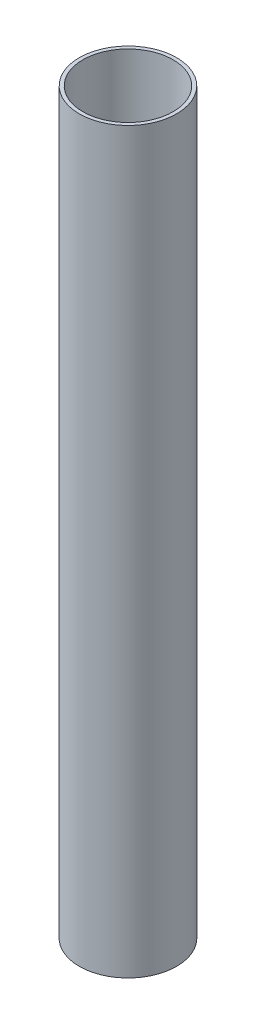
ISO-10303-21;
HEADER;
FILE_DESCRIPTION(('STEP AP214'),'2;1');
FILE_NAME('part.step','',(''),(''),'','','');
FILE_SCHEMA(('AUTOMOTIVE_DESIGN { 1 0 10303 214 1 1 1 1 }'));
ENDSEC;
DATA;
#1=APPLICATION_CONTEXT('core data for automotive mechanical design processes');
#2=APPLICATION_PROTOCOL_DEFINITION('international standard','automotive_design',2000,#1);
#3=PRODUCT_CONTEXT('',#1,'mechanical');
#4=PRODUCT('Part','Part','',(#3));
#5=PRODUCT_RELATED_PRODUCT_CATEGORY('part','',(#4));
#6=PRODUCT_DEFINITION_FORMATION('','',#4);
#7=PRODUCT_DEFINITION_CONTEXT('part definition',#1,'design');
#8=PRODUCT_DEFINITION('design','',#6,#7);
#9=PRODUCT_DEFINITION_SHAPE('','',#8);
#10=(LENGTH_UNIT() NAMED_UNIT(*) SI_UNIT(.MILLI.,.METRE.));
#11=(NAMED_UNIT(*) PLANE_ANGLE_UNIT() SI_UNIT($,.RADIAN.));
#12=(NAMED_UNIT(*) SI_UNIT($,.STERADIAN.) SOLID_ANGLE_UNIT());
#13=UNCERTAINTY_MEASURE_WITH_UNIT(LENGTH_MEASURE(1.E-05),#10,'distance_accuracy_value','');
#14=(GEOMETRIC_REPRESENTATION_CONTEXT(3) GLOBAL_UNCERTAINTY_ASSIGNED_CONTEXT((#13)) GLOBAL_UNIT_ASSIGNED_CONTEXT((#10,
#11,#12)) REPRESENTATION_CONTEXT('',''));
#15=CARTESIAN_POINT('',(0.,0.,0.));
#16=DIRECTION('',(0.,0.,1.));
#17=DIRECTION('',(1.,0.,0.));
#18=AXIS2_PLACEMENT_3D('',#15,#16,#17);
#19=CARTESIAN_POINT('',(0.,311.,0.));
#20=DIRECTION('',(0.,1.,0.));
#21=DIRECTION('',(0.,0.,1.));
#22=AXIS2_PLACEMENT_3D('',#19,#20,#21);
#23=PLANE('',#22);
#24=CARTESIAN_POINT('',(0.,311.,0.));
#25=DIRECTION('',(0.,1.,0.));
#26=DIRECTION('',(0.,0.,1.));
#27=AXIS2_PLACEMENT_3D('',#24,#25,#26);
#28=CIRCLE('',#27,20.5);
#29=CARTESIAN_POINT('',(0.,311.,20.5));
#30=VERTEX_POINT('',#29);
#31=EDGE_CURVE('E10',#30,#30,#28,.T.);
#32=ORIENTED_EDGE('',*,*,#31,.T.);
#33=EDGE_LOOP('',(#32));
#34=FACE_BOUND('',#33,.T.);
#35=CARTESIAN_POINT('',(0.,311.,0.));
#36=DIRECTION('',(0.,1.,0.));
#37=DIRECTION('',(0.,0.,1.));
#38=AXIS2_PLACEMENT_3D('',#35,#36,#37);
#39=CIRCLE('',#38,19.);
#40=CARTESIAN_POINT('',(0.,311.,19.));
#41=VERTEX_POINT('',#40);
#42=EDGE_CURVE('E48',#41,#41,#39,.T.);
#43=ORIENTED_EDGE('',*,*,#42,.F.);
#44=EDGE_LOOP('',(#43));
#45=FACE_BOUND('',#44,.T.);
#46=ADVANCED_FACE('F37',(#34,#45),#23,.T.);
#47=CARTESIAN_POINT('',(0.,0.,0.));
#48=DIRECTION('',(0.,1.,0.));
#49=DIRECTION('',(0.,0.,1.));
#50=AXIS2_PLACEMENT_3D('',#47,#48,#49);
#51=PLANE('',#50);
#52=CARTESIAN_POINT('',(0.,0.,0.));
#53=DIRECTION('',(0.,1.,0.));
#54=DIRECTION('',(0.,0.,1.));
#55=AXIS2_PLACEMENT_3D('',#52,#53,#54);
#56=CIRCLE('',#55,20.5);
#57=CARTESIAN_POINT('',(0.,0.,20.5));
#58=VERTEX_POINT('',#57);
#59=EDGE_CURVE('E41',#58,#58,#56,.T.);
#60=ORIENTED_EDGE('',*,*,#59,.F.);
#61=EDGE_LOOP('',(#60));
#62=FACE_BOUND('',#61,.T.);
#63=CARTESIAN_POINT('',(0.,0.,0.));
#64=DIRECTION('',(0.,1.,0.));
#65=DIRECTION('',(0.,0.,1.));
#66=AXIS2_PLACEMENT_3D('',#63,#64,#65);
#67=CIRCLE('',#66,19.);
#68=CARTESIAN_POINT('',(0.,0.,19.));
#69=VERTEX_POINT('',#68);
#70=EDGE_CURVE('E50',#69,#69,#67,.T.);
#71=ORIENTED_EDGE('',*,*,#70,.T.);
#72=EDGE_LOOP('',(#71));
#73=FACE_BOUND('',#72,.T.);
#74=ADVANCED_FACE('F60',(#62,#73),#51,.F.);
#75=CARTESIAN_POINT('',(0.,311.,0.));
#76=DIRECTION('',(0.,-1.,0.));
#77=DIRECTION('',(0.,0.,-1.));
#78=AXIS2_PLACEMENT_3D('',#75,#76,#77);
#79=CYLINDRICAL_SURFACE('',#78,20.5);
#80=ORIENTED_EDGE('',*,*,#31,.F.);
#81=EDGE_LOOP('',(#80));
#82=FACE_BOUND('',#81,.T.);
#83=ORIENTED_EDGE('',*,*,#59,.T.);
#84=EDGE_LOOP('',(#83));
#85=FACE_BOUND('',#84,.T.);
#86=ADVANCED_FACE('F39',(#82,#85),#79,.T.);
#87=CARTESIAN_POINT('',(0.,311.,0.));
#88=DIRECTION('',(0.,-1.,0.));
#89=DIRECTION('',(0.,0.,-1.));
#90=AXIS2_PLACEMENT_3D('',#87,#88,#89);
#91=CYLINDRICAL_SURFACE('',#90,19.);
#92=ORIENTED_EDGE('',*,*,#42,.T.);
#93=EDGE_LOOP('',(#92));
#94=FACE_BOUND('',#93,.T.);
#95=ORIENTED_EDGE('',*,*,#70,.F.);
#96=EDGE_LOOP('',(#95));
#97=FACE_BOUND('',#96,.T.);
#98=ADVANCED_FACE('F56',(#94,#97),#91,.F.);
#99=CLOSED_SHELL('',(#46,#74,#86,#98));
#100=MANIFOLD_SOLID_BREP('B2',#99);
#101=ADVANCED_BREP_SHAPE_REPRESENTATION('',(#18,#100),#14);
#102=SHAPE_DEFINITION_REPRESENTATION(#9,#101);
ENDSEC;
END-ISO-10303-21;
